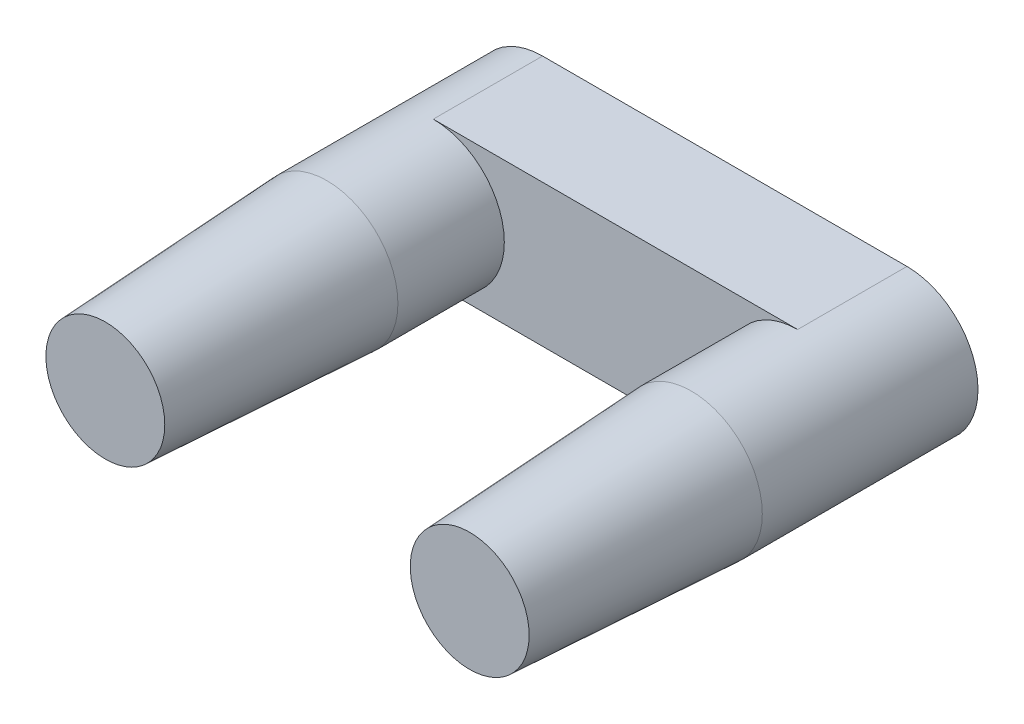
ISO-10303-21;
HEADER;
FILE_DESCRIPTION(('STEP AP214'),'2;1');
FILE_NAME('part.step','',(''),(''),'','','');
FILE_SCHEMA(('AUTOMOTIVE_DESIGN { 1 0 10303 214 1 1 1 1 }'));
ENDSEC;
DATA;
#1=APPLICATION_CONTEXT('core data for automotive mechanical design processes');
#2=APPLICATION_PROTOCOL_DEFINITION('international standard','automotive_design',2000,#1);
#3=PRODUCT_CONTEXT('',#1,'mechanical');
#4=PRODUCT('Part','Part','',(#3));
#5=PRODUCT_RELATED_PRODUCT_CATEGORY('part','',(#4));
#6=PRODUCT_DEFINITION_FORMATION('','',#4);
#7=PRODUCT_DEFINITION_CONTEXT('part definition',#1,'design');
#8=PRODUCT_DEFINITION('design','',#6,#7);
#9=PRODUCT_DEFINITION_SHAPE('','',#8);
#10=(LENGTH_UNIT() NAMED_UNIT(*) SI_UNIT(.MILLI.,.METRE.));
#11=(NAMED_UNIT(*) PLANE_ANGLE_UNIT() SI_UNIT($,.RADIAN.));
#12=(NAMED_UNIT(*) SI_UNIT($,.STERADIAN.) SOLID_ANGLE_UNIT());
#13=UNCERTAINTY_MEASURE_WITH_UNIT(LENGTH_MEASURE(1.E-05),#10,'distance_accuracy_value','');
#14=(GEOMETRIC_REPRESENTATION_CONTEXT(3) GLOBAL_UNCERTAINTY_ASSIGNED_CONTEXT((#13)) GLOBAL_UNIT_ASSIGNED_CONTEXT((#10,
#11,#12)) REPRESENTATION_CONTEXT('',''));
#15=CARTESIAN_POINT('',(0.,0.,0.));
#16=DIRECTION('',(0.,0.,1.));
#17=DIRECTION('',(1.,0.,0.));
#18=AXIS2_PLACEMENT_3D('',#15,#16,#17);
#19=CARTESIAN_POINT('',(0.,0.,0.));
#20=DIRECTION('',(0.,0.,1.));
#21=DIRECTION('',(1.,0.,0.));
#22=AXIS2_PLACEMENT_3D('',#19,#20,#21);
#23=PLANE('',#22);
#24=DIRECTION('',(1.,0.,0.));
#25=VECTOR('',#24,1.);
#26=CARTESIAN_POINT('',(0.,-1.95,0.));
#27=LINE('',#26,#25);
#28=CARTESIAN_POINT('',(-10.,-1.95,0.));
#29=VERTEX_POINT('',#28);
#30=CARTESIAN_POINT('',(0.,-1.95,0.));
#31=VERTEX_POINT('',#30);
#32=EDGE_CURVE('E97',#29,#31,#27,.T.);
#33=ORIENTED_EDGE('',*,*,#32,.T.);
#34=CARTESIAN_POINT('',(0.,0.,0.));
#35=DIRECTION('',(0.,0.,1.));
#36=DIRECTION('',(1.,0.,0.));
#37=AXIS2_PLACEMENT_3D('',#34,#35,#36);
#38=CIRCLE('',#37,1.95);
#39=CARTESIAN_POINT('',(0.,1.95,0.));
#40=VERTEX_POINT('',#39);
#41=EDGE_CURVE('E98',#40,#31,#38,.T.);
#42=ORIENTED_EDGE('',*,*,#41,.F.);
#43=DIRECTION('',(1.,0.,0.));
#44=VECTOR('',#43,1.);
#45=CARTESIAN_POINT('',(0.,1.95,0.));
#46=LINE('',#45,#44);
#47=CARTESIAN_POINT('',(-10.,1.95,0.));
#48=VERTEX_POINT('',#47);
#49=EDGE_CURVE('E57',#48,#40,#46,.T.);
#50=ORIENTED_EDGE('',*,*,#49,.F.);
#51=CARTESIAN_POINT('',(-10.,0.,0.));
#52=DIRECTION('',(0.,0.,1.));
#53=DIRECTION('',(1.,0.,0.));
#54=AXIS2_PLACEMENT_3D('',#51,#52,#53);
#55=CIRCLE('',#54,1.95);
#56=EDGE_CURVE('E105',#29,#48,#55,.T.);
#57=ORIENTED_EDGE('',*,*,#56,.F.);
#58=EDGE_LOOP('',(#33,#42,#50,#57));
#59=FACE_BOUND('',#58,.T.);
#60=ADVANCED_FACE('F40',(#59),#23,.T.);
#61=CARTESIAN_POINT('',(-10.,0.,9.));
#62=DIRECTION('',(0.,0.,-1.));
#63=DIRECTION('',(-1.,0.,0.));
#64=AXIS2_PLACEMENT_3D('',#61,#62,#63);
#65=CYLINDRICAL_SURFACE('',#64,1.95);
#66=CARTESIAN_POINT('',(-10.,0.,2.92000000000021));
#67=DIRECTION('',(0.,0.,1.));
#68=DIRECTION('',(1.,0.,0.));
#69=AXIS2_PLACEMENT_3D('',#66,#67,#68);
#70=CIRCLE('',#69,1.95);
#71=CARTESIAN_POINT('',(-8.05,0.,2.92000000000021));
#72=VERTEX_POINT('',#71);
#73=EDGE_CURVE('E11',#72,#72,#70,.F.);
#74=ORIENTED_EDGE('',*,*,#73,.T.);
#75=EDGE_LOOP('',(#74));
#76=FACE_BOUND('',#75,.T.);
#77=ORIENTED_EDGE('',*,*,#56,.T.);
#78=DIRECTION('',(0.,0.,1.));
#79=VECTOR('',#78,1.);
#80=CARTESIAN_POINT('',(-10.,1.95,-3.));
#81=LINE('',#80,#79);
#82=CARTESIAN_POINT('',(-10.,1.95,-3.));
#83=VERTEX_POINT('',#82);
#84=EDGE_CURVE('E88',#83,#48,#81,.T.);
#85=ORIENTED_EDGE('',*,*,#84,.F.);
#86=CARTESIAN_POINT('',(-10.,0.,-3.));
#87=DIRECTION('',(0.,0.,1.));
#88=DIRECTION('',(1.,0.,0.));
#89=AXIS2_PLACEMENT_3D('',#86,#87,#88);
#90=CIRCLE('',#89,1.95);
#91=CARTESIAN_POINT('',(-10.,-1.95,-3.));
#92=VERTEX_POINT('',#91);
#93=EDGE_CURVE('E112',#83,#92,#90,.T.);
#94=ORIENTED_EDGE('',*,*,#93,.T.);
#95=DIRECTION('',(0.,0.,1.));
#96=VECTOR('',#95,1.);
#97=CARTESIAN_POINT('',(-10.,-1.95,-3.));
#98=LINE('',#97,#96);
#99=EDGE_CURVE('E124',#92,#29,#98,.T.);
#100=ORIENTED_EDGE('',*,*,#99,.T.);
#101=EDGE_LOOP('',(#77,#85,#94,#100));
#102=FACE_BOUND('',#101,.T.);
#103=ADVANCED_FACE('F155',(#76,#102),#65,.T.);
#104=CARTESIAN_POINT('',(0.,0.,9.));
#105=DIRECTION('',(0.,0.,1.));
#106=DIRECTION('',(1.,0.,0.));
#107=AXIS2_PLACEMENT_3D('',#104,#105,#106);
#108=PLANE('',#107);
#109=CARTESIAN_POINT('',(-10.,0.,9.));
#110=DIRECTION('',(0.,0.,1.));
#111=DIRECTION('',(1.,0.,0.));
#112=AXIS2_PLACEMENT_3D('',#109,#110,#111);
#113=CIRCLE('',#112,1.63136070195914);
#114=CARTESIAN_POINT('',(-8.36863929804086,0.,9.));
#115=VERTEX_POINT('',#114);
#116=EDGE_CURVE('E50',#115,#115,#113,.T.);
#117=ORIENTED_EDGE('',*,*,#116,.T.);
#118=EDGE_LOOP('',(#117));
#119=FACE_BOUND('',#118,.T.);
#120=ADVANCED_FACE('F143',(#119),#108,.T.);
#121=CARTESIAN_POINT('',(0.,1.95,-3.));
#122=DIRECTION('',(0.,-1.,0.));
#123=DIRECTION('',(1.,0.,0.));
#124=AXIS2_PLACEMENT_3D('',#121,#122,#123);
#125=PLANE('',#124);
#126=ORIENTED_EDGE('',*,*,#49,.T.);
#127=DIRECTION('',(0.,0.,1.));
#128=VECTOR('',#127,1.);
#129=CARTESIAN_POINT('',(0.,1.95,-3.));
#130=LINE('',#129,#128);
#131=CARTESIAN_POINT('',(0.,1.95,-3.));
#132=VERTEX_POINT('',#131);
#133=EDGE_CURVE('E94',#132,#40,#130,.T.);
#134=ORIENTED_EDGE('',*,*,#133,.F.);
#135=DIRECTION('',(1.,0.,0.));
#136=VECTOR('',#135,1.);
#137=CARTESIAN_POINT('',(0.,1.95,-3.));
#138=LINE('',#137,#136);
#139=EDGE_CURVE('E66',#83,#132,#138,.T.);
#140=ORIENTED_EDGE('',*,*,#139,.F.);
#141=ORIENTED_EDGE('',*,*,#84,.T.);
#142=EDGE_LOOP('',(#126,#134,#140,#141));
#143=FACE_BOUND('',#142,.T.);
#144=ADVANCED_FACE('F93',(#143),#125,.F.);
#145=CARTESIAN_POINT('',(0.,0.,-3.));
#146=DIRECTION('',(0.,0.,1.));
#147=DIRECTION('',(1.,0.,0.));
#148=AXIS2_PLACEMENT_3D('',#145,#146,#147);
#149=CYLINDRICAL_SURFACE('',#148,1.95);
#150=CARTESIAN_POINT('',(0.,0.,2.9199999999997));
#151=DIRECTION('',(0.,0.,1.));
#152=DIRECTION('',(1.,0.,0.));
#153=AXIS2_PLACEMENT_3D('',#150,#151,#152);
#154=CIRCLE('',#153,1.95);
#155=CARTESIAN_POINT('',(1.95,0.,2.9199999999997));
#156=VERTEX_POINT('',#155);
#157=EDGE_CURVE('E136',#156,#156,#154,.F.);
#158=ORIENTED_EDGE('',*,*,#157,.T.);
#159=EDGE_LOOP('',(#158));
#160=FACE_BOUND('',#159,.T.);
#161=ORIENTED_EDGE('',*,*,#133,.T.);
#162=ORIENTED_EDGE('',*,*,#41,.T.);
#163=DIRECTION('',(0.,0.,1.));
#164=VECTOR('',#163,1.);
#165=CARTESIAN_POINT('',(0.,-1.95,-3.));
#166=LINE('',#165,#164);
#167=CARTESIAN_POINT('',(0.,-1.95,-3.));
#168=VERTEX_POINT('',#167);
#169=EDGE_CURVE('E81',#168,#31,#166,.T.);
#170=ORIENTED_EDGE('',*,*,#169,.F.);
#171=CARTESIAN_POINT('',(0.,0.,-3.));
#172=DIRECTION('',(0.,0.,1.));
#173=DIRECTION('',(1.,0.,0.));
#174=AXIS2_PLACEMENT_3D('',#171,#172,#173);
#175=CIRCLE('',#174,1.95);
#176=EDGE_CURVE('E103',#168,#132,#175,.T.);
#177=ORIENTED_EDGE('',*,*,#176,.T.);
#178=EDGE_LOOP('',(#161,#162,#170,#177));
#179=FACE_BOUND('',#178,.T.);
#180=ADVANCED_FACE('F102',(#160,#179),#149,.T.);
#181=CARTESIAN_POINT('',(0.,-1.95,-3.));
#182=DIRECTION('',(0.,-1.,0.));
#183=DIRECTION('',(1.,0.,0.));
#184=AXIS2_PLACEMENT_3D('',#181,#182,#183);
#185=PLANE('',#184);
#186=ORIENTED_EDGE('',*,*,#32,.F.);
#187=ORIENTED_EDGE('',*,*,#99,.F.);
#188=DIRECTION('',(1.,0.,0.));
#189=VECTOR('',#188,1.);
#190=CARTESIAN_POINT('',(0.,-1.95,-3.));
#191=LINE('',#190,#189);
#192=EDGE_CURVE('E115',#92,#168,#191,.T.);
#193=ORIENTED_EDGE('',*,*,#192,.T.);
#194=ORIENTED_EDGE('',*,*,#169,.T.);
#195=EDGE_LOOP('',(#186,#187,#193,#194));
#196=FACE_BOUND('',#195,.T.);
#197=ADVANCED_FACE('F169',(#196),#185,.T.);
#198=CARTESIAN_POINT('',(0.,0.,-3.));
#199=DIRECTION('',(0.,0.,1.));
#200=DIRECTION('',(1.,0.,0.));
#201=AXIS2_PLACEMENT_3D('',#198,#199,#200);
#202=PLANE('',#201);
#203=ORIENTED_EDGE('',*,*,#139,.T.);
#204=ORIENTED_EDGE('',*,*,#176,.F.);
#205=ORIENTED_EDGE('',*,*,#192,.F.);
#206=ORIENTED_EDGE('',*,*,#93,.F.);
#207=EDGE_LOOP('',(#203,#204,#205,#206));
#208=FACE_BOUND('',#207,.T.);
#209=ADVANCED_FACE('F165',(#208),#202,.F.);
#210=CARTESIAN_POINT('',(0.,0.,9.));
#211=DIRECTION('',(0.,0.,1.));
#212=DIRECTION('',(1.,0.,0.));
#213=AXIS2_PLACEMENT_3D('',#210,#211,#212);
#214=PLANE('',#213);
#215=CARTESIAN_POINT('',(0.,0.,9.));
#216=DIRECTION('',(0.,0.,1.));
#217=DIRECTION('',(1.,0.,0.));
#218=AXIS2_PLACEMENT_3D('',#215,#216,#217);
#219=CIRCLE('',#218,1.63136070195911);
#220=CARTESIAN_POINT('',(1.63136070195911,0.,9.));
#221=VERTEX_POINT('',#220);
#222=EDGE_CURVE('E132',#221,#221,#219,.T.);
#223=ORIENTED_EDGE('',*,*,#222,.T.);
#224=EDGE_LOOP('',(#223));
#225=FACE_BOUND('',#224,.T.);
#226=ADVANCED_FACE('F151',(#225),#214,.T.);
#227=CARTESIAN_POINT('',(0.,0.,9.));
#228=DIRECTION('',(0.,0.,-1.));
#229=DIRECTION('',(-1.,0.,0.));
#230=AXIS2_PLACEMENT_3D('',#227,#228,#229);
#231=CONICAL_SURFACE('',#230,1.63136070195911,0.0523598775598266);
#232=ORIENTED_EDGE('',*,*,#157,.F.);
#233=EDGE_LOOP('',(#232));
#234=FACE_BOUND('',#233,.T.);
#235=ORIENTED_EDGE('',*,*,#222,.F.);
#236=EDGE_LOOP('',(#235));
#237=FACE_BOUND('',#236,.T.);
#238=ADVANCED_FACE('F146',(#234,#237),#231,.T.);
#239=CARTESIAN_POINT('',(-10.,0.,9.));
#240=DIRECTION('',(0.,0.,-1.));
#241=DIRECTION('',(-1.,0.,0.));
#242=AXIS2_PLACEMENT_3D('',#239,#240,#241);
#243=CONICAL_SURFACE('',#242,1.63136070195914,0.0523598775598265);
#244=ORIENTED_EDGE('',*,*,#73,.F.);
#245=EDGE_LOOP('',(#244));
#246=FACE_BOUND('',#245,.T.);
#247=ORIENTED_EDGE('',*,*,#116,.F.);
#248=EDGE_LOOP('',(#247));
#249=FACE_BOUND('',#248,.T.);
#250=ADVANCED_FACE('F43',(#246,#249),#243,.T.);
#251=CLOSED_SHELL('',(#60,#103,#120,#144,#180,#197,#209,#226,#238,#250));
#252=MANIFOLD_SOLID_BREP('B2',#251);
#253=ADVANCED_BREP_SHAPE_REPRESENTATION('',(#18,#252),#14);
#254=SHAPE_DEFINITION_REPRESENTATION(#9,#253);
ENDSEC;
END-ISO-10303-21;
